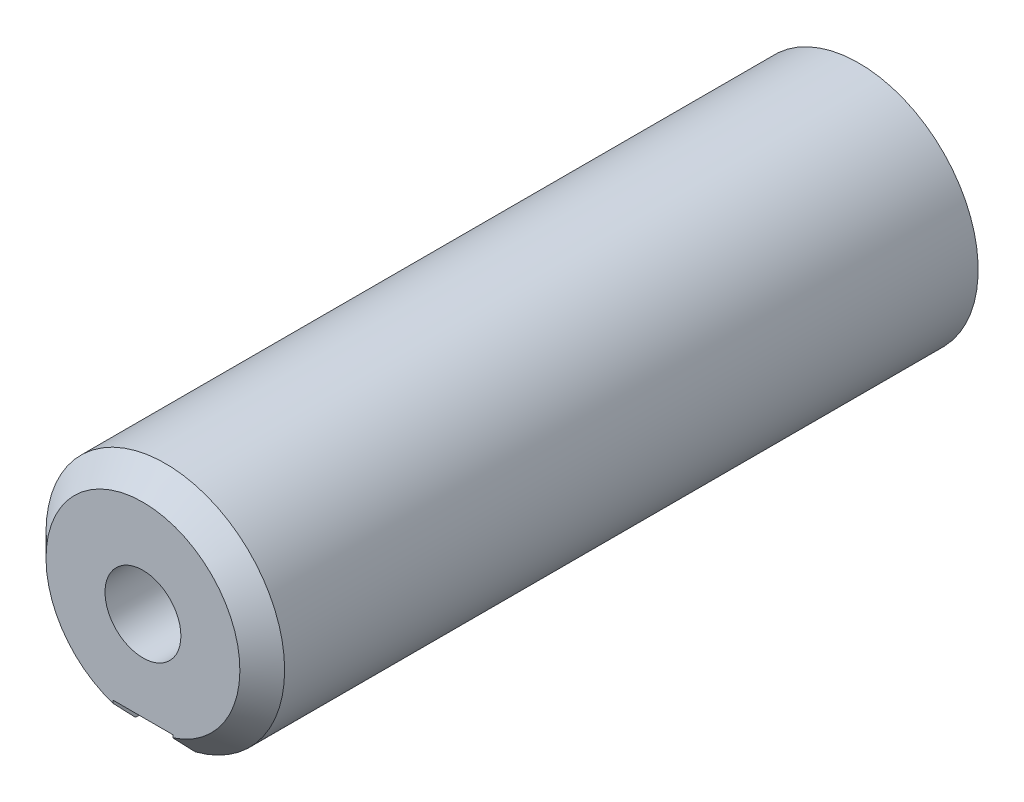
ISO-10303-21;
HEADER;
FILE_DESCRIPTION(('STEP AP214'),'2;1');
FILE_NAME('part.step','',(''),(''),'','','');
FILE_SCHEMA(('AUTOMOTIVE_DESIGN { 1 0 10303 214 1 1 1 1 }'));
ENDSEC;
DATA;
#1=APPLICATION_CONTEXT('core data for automotive mechanical design processes');
#2=APPLICATION_PROTOCOL_DEFINITION('international standard','automotive_design',2000,#1);
#3=PRODUCT_CONTEXT('',#1,'mechanical');
#4=PRODUCT('Part','Part','',(#3));
#5=PRODUCT_RELATED_PRODUCT_CATEGORY('part','',(#4));
#6=PRODUCT_DEFINITION_FORMATION('','',#4);
#7=PRODUCT_DEFINITION_CONTEXT('part definition',#1,'design');
#8=PRODUCT_DEFINITION('design','',#6,#7);
#9=PRODUCT_DEFINITION_SHAPE('','',#8);
#10=(LENGTH_UNIT() NAMED_UNIT(*) SI_UNIT(.MILLI.,.METRE.));
#11=(NAMED_UNIT(*) PLANE_ANGLE_UNIT() SI_UNIT($,.RADIAN.));
#12=(NAMED_UNIT(*) SI_UNIT($,.STERADIAN.) SOLID_ANGLE_UNIT());
#13=UNCERTAINTY_MEASURE_WITH_UNIT(LENGTH_MEASURE(1.E-05),#10,'distance_accuracy_value','');
#14=(GEOMETRIC_REPRESENTATION_CONTEXT(3) GLOBAL_UNCERTAINTY_ASSIGNED_CONTEXT((#13)) GLOBAL_UNIT_ASSIGNED_CONTEXT((#10,
#11,#12)) REPRESENTATION_CONTEXT('',''));
#15=CARTESIAN_POINT('',(0.,0.,0.));
#16=DIRECTION('',(0.,0.,1.));
#17=DIRECTION('',(1.,0.,0.));
#18=AXIS2_PLACEMENT_3D('',#15,#16,#17);
#19=CARTESIAN_POINT('',(0.,0.,24.3839999999409));
#20=DIRECTION('',(0.,0.,1.));
#21=DIRECTION('',(1.,0.,0.));
#22=AXIS2_PLACEMENT_3D('',#19,#20,#21);
#23=CONICAL_SURFACE('',#22,2.0192999998585,1.0297442585643);
#24=CARTESIAN_POINT('',(-5.6843418860808E-11,0.,23.1706821519708));
#25=VERTEX_POINT('',#24);
#26=VERTEX_LOOP('',#25);
#27=FACE_BOUND('',#26,.T.);
#28=CARTESIAN_POINT('',(0.,0.,24.384));
#29=DIRECTION('',(0.,0.,1.));
#30=DIRECTION('',(1.,0.,0.));
#31=AXIS2_PLACEMENT_3D('',#28,#29,#30);
#32=CIRCLE('',#31,2.01929999999999);
#33=CARTESIAN_POINT('',(2.01929999999999,0.,24.384));
#34=VERTEX_POINT('',#33);
#35=EDGE_CURVE('E114',#34,#34,#32,.T.);
#36=ORIENTED_EDGE('',*,*,#35,.T.);
#37=EDGE_LOOP('',(#36));
#38=FACE_BOUND('',#37,.T.);
#39=ADVANCED_FACE('F17',(#27,#38),#23,.F.);
#40=CARTESIAN_POINT('',(0.,0.,38.1));
#41=DIRECTION('',(0.,0.,1.));
#42=DIRECTION('',(1.,0.,0.));
#43=AXIS2_PLACEMENT_3D('',#40,#41,#42);
#44=CYLINDRICAL_SURFACE('',#43,2.01929999999999);
#45=CARTESIAN_POINT('',(0.,0.,38.1));
#46=DIRECTION('',(0.,0.,1.));
#47=DIRECTION('',(1.,0.,0.));
#48=AXIS2_PLACEMENT_3D('',#45,#46,#47);
#49=CIRCLE('',#48,2.01929999999999);
#50=CARTESIAN_POINT('',(2.01929999999999,0.,38.1));
#51=VERTEX_POINT('',#50);
#52=EDGE_CURVE('E20',#51,#51,#49,.F.);
#53=ORIENTED_EDGE('',*,*,#52,.F.);
#54=EDGE_LOOP('',(#53));
#55=FACE_BOUND('',#54,.T.);
#56=ORIENTED_EDGE('',*,*,#35,.F.);
#57=EDGE_LOOP('',(#56));
#58=FACE_BOUND('',#57,.T.);
#59=ADVANCED_FACE('F155',(#55,#58),#44,.F.);
#60=CARTESIAN_POINT('',(0.,-4.7625,3.175));
#61=DIRECTION('',(0.,1.,0.));
#62=DIRECTION('',(0.,0.,1.));
#63=AXIS2_PLACEMENT_3D('',#60,#61,#62);
#64=PLANE('',#63);
#65=DIRECTION('',(0.,0.,1.));
#66=VECTOR('',#65,1.);
#67=CARTESIAN_POINT('',(1.5875,-4.7625,3.175));
#68=LINE('',#67,#66);
#69=CARTESIAN_POINT('',(1.5875,-4.7625,38.1));
#70=VERTEX_POINT('',#69);
#71=CARTESIAN_POINT('',(1.5875,-4.7625,3.175));
#72=VERTEX_POINT('',#71);
#73=EDGE_CURVE('E76',#70,#72,#68,.F.);
#74=ORIENTED_EDGE('',*,*,#73,.F.);
#75=DIRECTION('',(1.,0.,0.));
#76=VECTOR('',#75,1.);
#77=CARTESIAN_POINT('',(0.,-4.7625,38.1));
#78=LINE('',#77,#76);
#79=CARTESIAN_POINT('',(-1.5875,-4.7625,38.1));
#80=VERTEX_POINT('',#79);
#81=EDGE_CURVE('E106',#80,#70,#78,.T.);
#82=ORIENTED_EDGE('',*,*,#81,.F.);
#83=DIRECTION('',(0.,0.,-1.));
#84=VECTOR('',#83,1.);
#85=CARTESIAN_POINT('',(-1.5875,-4.7625,38.1));
#86=LINE('',#85,#84);
#87=CARTESIAN_POINT('',(-1.5875,-4.7625,3.175));
#88=VERTEX_POINT('',#87);
#89=EDGE_CURVE('E95',#88,#80,#86,.F.);
#90=ORIENTED_EDGE('',*,*,#89,.F.);
#91=CARTESIAN_POINT('',(0.,-4.7625,3.175));
#92=DIRECTION('',(0.,-1.,0.));
#93=DIRECTION('',(0.,0.,-1.));
#94=AXIS2_PLACEMENT_3D('',#91,#92,#93);
#95=CIRCLE('',#94,1.5875);
#96=EDGE_CURVE('E77',#88,#72,#95,.T.);
#97=ORIENTED_EDGE('',*,*,#96,.T.);
#98=EDGE_LOOP('',(#74,#82,#90,#97));
#99=FACE_BOUND('',#98,.T.);
#100=ADVANCED_FACE('F152',(#99),#64,.F.);
#101=CARTESIAN_POINT('',(0.,0.,38.1));
#102=DIRECTION('',(0.,0.,1.));
#103=DIRECTION('',(1.,0.,0.));
#104=AXIS2_PLACEMENT_3D('',#101,#102,#103);
#105=PLANE('',#104);
#106=DIRECTION('',(0.,1.,0.));
#107=VECTOR('',#106,1.);
#108=CARTESIAN_POINT('',(-1.5875,-4.7625,38.1));
#109=LINE('',#108,#107);
#110=CARTESIAN_POINT('',(-1.5875,-4.90907263546915,38.0999999999645));
#111=VERTEX_POINT('',#110);
#112=EDGE_CURVE('E90',#80,#111,#109,.F.);
#113=ORIENTED_EDGE('',*,*,#112,.F.);
#114=ORIENTED_EDGE('',*,*,#81,.T.);
#115=DIRECTION('',(0.,1.,0.));
#116=VECTOR('',#115,1.);
#117=CARTESIAN_POINT('',(1.5875,-4.7625,38.1));
#118=LINE('',#117,#116);
#119=CARTESIAN_POINT('',(1.5875,-4.90907263546915,38.0999999999645));
#120=VERTEX_POINT('',#119);
#121=EDGE_CURVE('E97',#120,#70,#118,.T.);
#122=ORIENTED_EDGE('',*,*,#121,.F.);
#123=CARTESIAN_POINT('',(0.,0.,38.099999999929));
#124=DIRECTION('',(0.,0.,-1.));
#125=DIRECTION('',(-1.,0.,0.));
#126=AXIS2_PLACEMENT_3D('',#123,#124,#125);
#127=CIRCLE('',#126,5.15937500000518);
#128=EDGE_CURVE('E80',#111,#120,#127,.T.);
#129=ORIENTED_EDGE('',*,*,#128,.F.);
#130=EDGE_LOOP('',(#113,#114,#122,#129));
#131=FACE_BOUND('',#130,.T.);
#132=ORIENTED_EDGE('',*,*,#52,.T.);
#133=EDGE_LOOP('',(#132));
#134=FACE_BOUND('',#133,.T.);
#135=ADVANCED_FACE('F149',(#131,#134),#105,.T.);
#136=CARTESIAN_POINT('',(1.5875,-4.7625,3.175));
#137=DIRECTION('',(-1.,0.,0.));
#138=DIRECTION('',(0.,0.,1.));
#139=AXIS2_PLACEMENT_3D('',#136,#137,#138);
#140=PLANE('',#139);
#141=ORIENTED_EDGE('',*,*,#73,.T.);
#142=DIRECTION('',(0.,-1.,0.));
#143=VECTOR('',#142,1.);
#144=CARTESIAN_POINT('',(1.5875,-4.7625,3.175));
#145=LINE('',#144,#143);
#146=CARTESIAN_POINT('',(1.5875,-6.14836106210428,3.175));
#147=VERTEX_POINT('',#146);
#148=EDGE_CURVE('E62',#72,#147,#145,.T.);
#149=ORIENTED_EDGE('',*,*,#148,.T.);
#150=DIRECTION('',(0.,0.,-1.));
#151=VECTOR('',#150,1.);
#152=CARTESIAN_POINT('',(1.5875,-6.14836106210428,38.1));
#153=LINE('',#152,#151);
#154=CARTESIAN_POINT('',(1.5875,-6.14836106210202,36.9093749999977));
#155=VERTEX_POINT('',#154);
#156=EDGE_CURVE('E67',#155,#147,#153,.T.);
#157=ORIENTED_EDGE('',*,*,#156,.F.);
#158=CARTESIAN_POINT('',(1.5875,-6.14836106209977,36.9093749999954));
#159=CARTESIAN_POINT('',(1.5875,-6.04547265629884,37.0089945036276));
#160=CARTESIAN_POINT('',(1.5875,-5.94250785114597,37.1085352020304));
#161=CARTESIAN_POINT('',(1.5875,-5.73639719763521,37.3074280057075));
#162=CARTESIAN_POINT('',(1.5875,-5.63325135012356,37.4067801118588));
#163=CARTESIAN_POINT('',(1.5875,-5.42674927071043,37.605265810319));
#164=CARTESIAN_POINT('',(1.5875,-5.32339303852813,37.704399402336));
#165=CARTESIAN_POINT('',(1.5875,-5.11643030476504,37.9024059295262));
#166=CARTESIAN_POINT('',(1.5875,-5.01282380201709,38.0012788634794));
#167=CARTESIAN_POINT('',(1.5875,-4.9090726354757,38.0999999999583));
#168=B_SPLINE_CURVE_WITH_KNOTS('',3,(#158,#159,#160,#161,#162,#163,#164,#165,#166,#167),
.UNSPECIFIED.,.F.,.F.,(4,2,2,2,4),(0.,0.429640169668975,0.859278336405097,1.28891707700604,
1.71855782515147),.UNSPECIFIED.);
#169=EDGE_CURVE('E99',#155,#120,#168,.T.);
#170=ORIENTED_EDGE('',*,*,#169,.T.);
#171=ORIENTED_EDGE('',*,*,#121,.T.);
#172=EDGE_LOOP('',(#141,#149,#157,#170,#171));
#173=FACE_BOUND('',#172,.T.);
#174=ADVANCED_FACE('F72',(#173),#140,.T.);
#175=CARTESIAN_POINT('',(0.,-4.7625,3.175));
#176=DIRECTION('',(0.,-1.,0.));
#177=DIRECTION('',(0.,0.,-1.));
#178=AXIS2_PLACEMENT_3D('',#175,#176,#177);
#179=CYLINDRICAL_SURFACE('',#178,1.5875);
#180=ORIENTED_EDGE('',*,*,#96,.F.);
#181=DIRECTION('',(0.,1.,0.));
#182=VECTOR('',#181,1.);
#183=CARTESIAN_POINT('',(-1.5875,-4.7625,3.175));
#184=LINE('',#183,#182);
#185=CARTESIAN_POINT('',(-1.5875,-6.14836106210428,3.175));
#186=VERTEX_POINT('',#185);
#187=EDGE_CURVE('E64',#186,#88,#184,.T.);
#188=ORIENTED_EDGE('',*,*,#187,.F.);
#189=CARTESIAN_POINT('',(1.5875,-6.14836106210428,3.175));
#190=CARTESIAN_POINT('',(1.5875005347221,-6.14835810868573,3.13108504800572));
#191=CARTESIAN_POINT('',(1.58567661174546,-6.14883215713891,3.08719185612076));
#192=CARTESIAN_POINT('',(1.57840569717735,-6.15070373440419,2.99973374007763));
#193=CARTESIAN_POINT('',(1.57295931521448,-6.15210110782842,2.95616876193134));
#194=CARTESIAN_POINT('',(1.55126572658892,-6.15762215250041,2.82661823019263));
#195=CARTESIAN_POINT('',(1.5296637296004,-6.16307509376748,2.74152292592804));
#196=CARTESIAN_POINT('',(1.47287895457943,-6.17688995608207,2.57631312018059));
#197=CARTESIAN_POINT('',(1.43769722409701,-6.18525165274126,2.49619823505808));
#198=CARTESIAN_POINT('',(1.35479517756303,-6.20393662510198,2.34297047529257));
#199=CARTESIAN_POINT('',(1.30707194181756,-6.21426035741522,2.26985923653113));
#200=CARTESIAN_POINT('',(1.19933716705609,-6.2359570788775,2.13115606527993));
#201=CARTESIAN_POINT('',(1.13910300733151,-6.24734667388769,2.06573970062097));
#202=CARTESIAN_POINT('',(1.00851371119877,-6.26975132963679,1.94580623088576));
#203=CARTESIAN_POINT('',(0.938154957437517,-6.28076625476574,1.89129303804369));
#204=CARTESIAN_POINT('',(0.7880895358041,-6.30136714833112,1.79399185375317));
#205=CARTESIAN_POINT('',(0.708263180753404,-6.31093033514495,1.75138340439518));
#206=CARTESIAN_POINT('',(0.542357177260233,-6.32734283789912,1.68029965646819));
#207=CARTESIAN_POINT('',(0.456285166695506,-6.33419540463604,1.65180741816497));
#208=CARTESIAN_POINT('',(0.308152380307681,-6.34280690605921,1.61646213932075));
#209=CARTESIAN_POINT('',(0.247067257357141,-6.34549035539136,1.60562005304945));
#210=CARTESIAN_POINT('',(0.123996454410398,-6.3490876888745,1.59113769145862));
#211=CARTESIAN_POINT('',(0.0620107875574814,-6.35000159882553,1.58749731113757));
#212=CARTESIAN_POINT('',(-0.0876803967483865,-6.34999773933436,1.5875038019276));
#213=CARTESIAN_POINT('',(-0.175411016459903,-6.34816513335973,1.59479106717197));
#214=CARTESIAN_POINT('',(-0.348380525034391,-6.34102879138947,1.62371289354689));
#215=CARTESIAN_POINT('',(-0.433616958405865,-6.33572174751385,1.64536112746979));
#216=CARTESIAN_POINT('',(-0.599040292949289,-6.3222251242116,1.70226580793538));
#217=CARTESIAN_POINT('',(-0.679233912557538,-6.31403948009642,1.73750368251359));
#218=CARTESIAN_POINT('',(-0.832565934999314,-6.295657630496,1.82052815492047));
#219=CARTESIAN_POINT('',(-0.905704517218416,-6.28546147615125,1.86831443357091));
#220=CARTESIAN_POINT('',(-1.04436365780322,-6.2639303812146,1.97611942379232));
#221=CARTESIAN_POINT('',(-1.10971829889343,-6.25257786624046,2.03634803202059));
#222=CARTESIAN_POINT('',(-1.22951519838142,-6.23012963849484,2.16688424756372));
#223=CARTESIAN_POINT('',(-1.28395571935534,-6.21903396685865,2.23719345656345));
#224=CARTESIAN_POINT('',(-1.38116725538375,-6.19817668389335,2.38719176796653));
#225=CARTESIAN_POINT('',(-1.42374920363014,-6.18843780250455,2.46700671760313));
#226=CARTESIAN_POINT('',(-1.49480507045912,-6.17166094046041,2.6329268970427));
#227=CARTESIAN_POINT('',(-1.52328958149309,-6.16462093284007,2.71902734809026));
#228=CARTESIAN_POINT('',(-1.55859647860428,-6.15576956135879,2.86715803226436));
#229=CARTESIAN_POINT('',(-1.56941841449217,-6.15300921691423,2.92820781192737));
#230=CARTESIAN_POINT('',(-1.58387467718141,-6.14929718216966,3.05116074651224));
#231=CARTESIAN_POINT('',(-1.58751418051883,-6.14834418929123,3.11306325442806));
#232=CARTESIAN_POINT('',(-1.5875,-6.14836106210428,3.175));
#233=B_SPLINE_CURVE_WITH_KNOTS('',3,(#189,#190,#191,#192,#193,#194,#195,#196,#197,#198,#199,
#200,#201,#202,#203,#204,#205,#206,#207,#208,#209,#210,#211,#212,#213,#214,#215,#216,#217,#218,
#219,#220,#221,#222,#223,#224,#225,#226,#227,#228,#229,#230,#231,#232),.UNSPECIFIED.,.F.,.F.,(4,
2,2,2,2,2,2,2,2,2,2,2,2,2,2,2,2,2,2,2,2,4),(0.,0.131661631551339,0.26330111119063,
0.525827565802087,0.788333772987209,1.05090114649685,1.31861744482507,1.58642963242961,
1.85808613315677,2.12941584627081,2.31528840630686,2.50115825628403,2.76396966106689,
3.02703164315798,3.28973538447932,3.55243244437743,3.81998818241809,4.08758647901955,
4.35923443864515,4.6306779779321,4.81644389573688,5.00207587901887),.UNSPECIFIED.);
#234=EDGE_CURVE('E59',#147,#186,#233,.T.);
#235=ORIENTED_EDGE('',*,*,#234,.F.);
#236=ORIENTED_EDGE('',*,*,#148,.F.);
#237=EDGE_LOOP('',(#180,#188,#235,#236));
#238=FACE_BOUND('',#237,.T.);
#239=ADVANCED_FACE('F61',(#238),#179,.F.);
#240=CARTESIAN_POINT('',(-1.5875,-4.7625,38.1));
#241=DIRECTION('',(1.,0.,0.));
#242=DIRECTION('',(0.,0.,-1.));
#243=AXIS2_PLACEMENT_3D('',#240,#241,#242);
#244=PLANE('',#243);
#245=ORIENTED_EDGE('',*,*,#187,.T.);
#246=ORIENTED_EDGE('',*,*,#89,.T.);
#247=ORIENTED_EDGE('',*,*,#112,.T.);
#248=CARTESIAN_POINT('',(-1.5875,-6.1483610621003,36.9093749999948));
#249=CARTESIAN_POINT('',(-1.5875,-6.04547265629997,37.0089945036265));
#250=CARTESIAN_POINT('',(-1.5875,-5.94250785114768,37.1085352020288));
#251=CARTESIAN_POINT('',(-1.5875,-5.7363971976381,37.3074280057047));
#252=CARTESIAN_POINT('',(-1.5875,-5.63325135012705,37.4067801118554));
#253=CARTESIAN_POINT('',(-1.5875,-5.42674927071511,37.6052658103146));
#254=CARTESIAN_POINT('',(-1.5875,-5.3233930385334,37.704399402331));
#255=CARTESIAN_POINT('',(-1.5875,-5.11643030477151,37.9024059295201));
#256=CARTESIAN_POINT('',(-1.5875,-5.01282380202416,38.0012788634726));
#257=CARTESIAN_POINT('',(-1.5875,-4.90907263548337,38.099999999951));
#258=B_SPLINE_CURVE_WITH_KNOTS('',3,(#248,#249,#250,#251,#252,#253,#254,#255,#256,#257),
.UNSPECIFIED.,.F.,.F.,(4,2,2,2,4),(0.,0.429640169666518,0.85927833640018,1.28891707699866,
1.71855782514162),.UNSPECIFIED.);
#259=CARTESIAN_POINT('',(-1.5875,-6.14836106210229,36.9093749999974));
#260=VERTEX_POINT('',#259);
#261=EDGE_CURVE('E83',#260,#111,#258,.T.);
#262=ORIENTED_EDGE('',*,*,#261,.F.);
#263=DIRECTION('',(0.,0.,-1.));
#264=VECTOR('',#263,1.);
#265=CARTESIAN_POINT('',(-1.5875,-6.14836106210428,38.1));
#266=LINE('',#265,#264);
#267=EDGE_CURVE('E66',#186,#260,#266,.F.);
#268=ORIENTED_EDGE('',*,*,#267,.F.);
#269=EDGE_LOOP('',(#245,#246,#247,#262,#268));
#270=FACE_BOUND('',#269,.T.);
#271=ADVANCED_FACE('F136',(#270),#244,.T.);
#272=CARTESIAN_POINT('',(0.,0.,36.9093749999934));
#273=DIRECTION('',(0.,0.,-1.));
#274=DIRECTION('',(-1.,0.,0.));
#275=AXIS2_PLACEMENT_3D('',#272,#273,#274);
#276=CONICAL_SURFACE('',#275,6.34999999999764,0.78539816342132);
#277=CARTESIAN_POINT('',(0.,0.,36.909375));
#278=DIRECTION('',(0.,0.,-1.));
#279=DIRECTION('',(-1.,0.,0.));
#280=AXIS2_PLACEMENT_3D('',#277,#278,#279);
#281=CIRCLE('',#280,6.35);
#282=EDGE_CURVE('E26',#260,#155,#281,.T.);
#283=ORIENTED_EDGE('',*,*,#282,.F.);
#284=ORIENTED_EDGE('',*,*,#261,.T.);
#285=ORIENTED_EDGE('',*,*,#128,.T.);
#286=ORIENTED_EDGE('',*,*,#169,.F.);
#287=EDGE_LOOP('',(#283,#284,#285,#286));
#288=FACE_BOUND('',#287,.T.);
#289=ADVANCED_FACE('F132',(#288),#276,.T.);
#290=CARTESIAN_POINT('',(0.,0.,0.));
#291=DIRECTION('',(0.,0.,1.));
#292=DIRECTION('',(1.,0.,0.));
#293=AXIS2_PLACEMENT_3D('',#290,#291,#292);
#294=PLANE('',#293);
#295=CARTESIAN_POINT('',(0.,0.,0.));
#296=DIRECTION('',(0.,0.,-1.));
#297=DIRECTION('',(-1.,0.,0.));
#298=AXIS2_PLACEMENT_3D('',#295,#296,#297);
#299=CIRCLE('',#298,6.35);
#300=CARTESIAN_POINT('',(-6.35,0.,0.));
#301=VERTEX_POINT('',#300);
#302=EDGE_CURVE('E11',#301,#301,#299,.F.);
#303=ORIENTED_EDGE('',*,*,#302,.F.);
#304=EDGE_LOOP('',(#303));
#305=FACE_BOUND('',#304,.T.);
#306=ADVANCED_FACE('F128',(#305),#294,.F.);
#307=CARTESIAN_POINT('',(0.,0.,38.1));
#308=DIRECTION('',(0.,0.,-1.));
#309=DIRECTION('',(-1.,0.,0.));
#310=AXIS2_PLACEMENT_3D('',#307,#308,#309);
#311=CYLINDRICAL_SURFACE('',#310,6.35);
#312=ORIENTED_EDGE('',*,*,#302,.T.);
#313=EDGE_LOOP('',(#312));
#314=FACE_BOUND('',#313,.T.);
#315=ORIENTED_EDGE('',*,*,#282,.T.);
#316=ORIENTED_EDGE('',*,*,#156,.T.);
#317=ORIENTED_EDGE('',*,*,#234,.T.);
#318=ORIENTED_EDGE('',*,*,#267,.T.);
#319=EDGE_LOOP('',(#315,#316,#317,#318));
#320=FACE_BOUND('',#319,.T.);
#321=ADVANCED_FACE('F79',(#314,#320),#311,.T.);
#322=CLOSED_SHELL('',(#39,#59,#100,#135,#174,#239,#271,#289,#306,#321));
#323=MANIFOLD_SOLID_BREP('B1',#322);
#324=ADVANCED_BREP_SHAPE_REPRESENTATION('',(#18,#323),#14);
#325=SHAPE_DEFINITION_REPRESENTATION(#9,#324);
ENDSEC;
END-ISO-10303-21;
